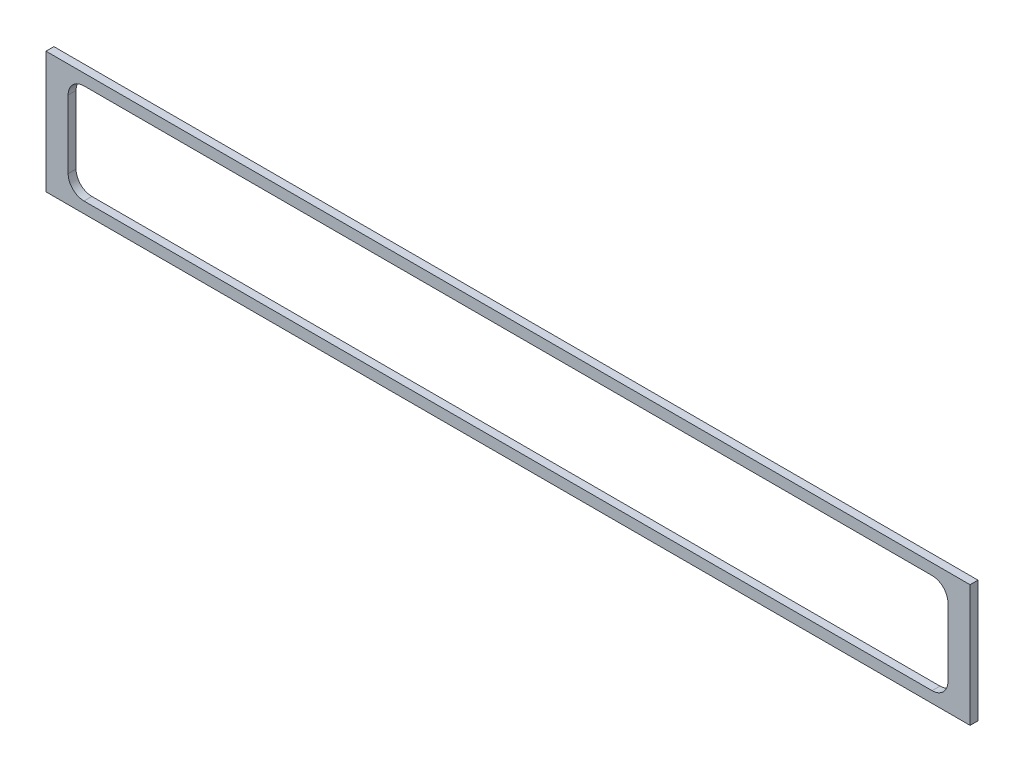
ISO-10303-21;
HEADER;
FILE_DESCRIPTION(('STEP AP214'),'2;1');
FILE_NAME('part.step','',(''),(''),'','','');
FILE_SCHEMA(('AUTOMOTIVE_DESIGN { 1 0 10303 214 1 1 1 1 }'));
ENDSEC;
DATA;
#1=APPLICATION_CONTEXT('core data for automotive mechanical design processes');
#2=APPLICATION_PROTOCOL_DEFINITION('international standard','automotive_design',2000,#1);
#3=PRODUCT_CONTEXT('',#1,'mechanical');
#4=PRODUCT('Part','Part','',(#3));
#5=PRODUCT_RELATED_PRODUCT_CATEGORY('part','',(#4));
#6=PRODUCT_DEFINITION_FORMATION('','',#4);
#7=PRODUCT_DEFINITION_CONTEXT('part definition',#1,'design');
#8=PRODUCT_DEFINITION('design','',#6,#7);
#9=PRODUCT_DEFINITION_SHAPE('','',#8);
#10=(LENGTH_UNIT() NAMED_UNIT(*) SI_UNIT(.MILLI.,.METRE.));
#11=(NAMED_UNIT(*) PLANE_ANGLE_UNIT() SI_UNIT($,.RADIAN.));
#12=(NAMED_UNIT(*) SI_UNIT($,.STERADIAN.) SOLID_ANGLE_UNIT());
#13=UNCERTAINTY_MEASURE_WITH_UNIT(LENGTH_MEASURE(1.E-05),#10,'distance_accuracy_value','');
#14=(GEOMETRIC_REPRESENTATION_CONTEXT(3) GLOBAL_UNCERTAINTY_ASSIGNED_CONTEXT((#13)) GLOBAL_UNIT_ASSIGNED_CONTEXT((#10,
#11,#12)) REPRESENTATION_CONTEXT('',''));
#15=CARTESIAN_POINT('',(0.,0.,0.));
#16=DIRECTION('',(0.,0.,1.));
#17=DIRECTION('',(1.,0.,0.));
#18=AXIS2_PLACEMENT_3D('',#15,#16,#17);
#19=CARTESIAN_POINT('',(-275.196525515744,118.258414766558,5.));
#20=DIRECTION('',(1.,0.,0.));
#21=DIRECTION('',(0.,0.,-1.));
#22=AXIS2_PLACEMENT_3D('',#19,#20,#21);
#23=PLANE('',#22);
#24=DIRECTION('',(0.,-1.,0.));
#25=VECTOR('',#24,1.);
#26=CARTESIAN_POINT('',(-275.196525515744,118.258414766558,0.));
#27=LINE('',#26,#25);
#28=CARTESIAN_POINT('',(-275.196525515744,118.258414766558,0.));
#29=VERTEX_POINT('',#28);
#30=CARTESIAN_POINT('',(-275.196525515744,41.2584147665581,0.));
#31=VERTEX_POINT('',#30);
#32=EDGE_CURVE('E203',#29,#31,#27,.T.);
#33=ORIENTED_EDGE('',*,*,#32,.T.);
#34=DIRECTION('',(0.,0.,-1.));
#35=VECTOR('',#34,1.);
#36=CARTESIAN_POINT('',(-275.196525515744,41.2584147665581,5.));
#37=LINE('',#36,#35);
#38=CARTESIAN_POINT('',(-275.196525515744,41.2584147665581,5.));
#39=VERTEX_POINT('',#38);
#40=EDGE_CURVE('E11',#39,#31,#37,.T.);
#41=ORIENTED_EDGE('',*,*,#40,.F.);
#42=DIRECTION('',(0.,-1.,0.));
#43=VECTOR('',#42,1.);
#44=CARTESIAN_POINT('',(-275.196525515744,118.258414766558,5.));
#45=LINE('',#44,#43);
#46=CARTESIAN_POINT('',(-275.196525515744,118.258414766558,5.));
#47=VERTEX_POINT('',#46);
#48=EDGE_CURVE('E221',#47,#39,#45,.T.);
#49=ORIENTED_EDGE('',*,*,#48,.F.);
#50=DIRECTION('',(0.,0.,-1.));
#51=VECTOR('',#50,1.);
#52=CARTESIAN_POINT('',(-275.196525515744,118.258414766558,5.));
#53=LINE('',#52,#51);
#54=EDGE_CURVE('E235',#47,#29,#53,.T.);
#55=ORIENTED_EDGE('',*,*,#54,.T.);
#56=EDGE_LOOP('',(#33,#41,#49,#55));
#57=FACE_BOUND('',#56,.T.);
#58=ADVANCED_FACE('F39',(#57),#23,.F.);
#59=CARTESIAN_POINT('',(-275.196525515744,41.2584147665581,5.));
#60=DIRECTION('',(0.,1.,0.));
#61=DIRECTION('',(0.,0.,1.));
#62=AXIS2_PLACEMENT_3D('',#59,#60,#61);
#63=PLANE('',#62);
#64=DIRECTION('',(1.,0.,0.));
#65=VECTOR('',#64,1.);
#66=CARTESIAN_POINT('',(-275.196525515744,41.2584147665581,0.));
#67=LINE('',#66,#65);
#68=CARTESIAN_POINT('',(308.803474484256,41.2584147665581,0.));
#69=VERTEX_POINT('',#68);
#70=EDGE_CURVE('E239',#31,#69,#67,.T.);
#71=ORIENTED_EDGE('',*,*,#70,.T.);
#72=DIRECTION('',(0.,0.,-1.));
#73=VECTOR('',#72,1.);
#74=CARTESIAN_POINT('',(308.803474484256,41.2584147665581,5.));
#75=LINE('',#74,#73);
#76=CARTESIAN_POINT('',(308.803474484256,41.2584147665581,5.));
#77=VERTEX_POINT('',#76);
#78=EDGE_CURVE('E47',#77,#69,#75,.T.);
#79=ORIENTED_EDGE('',*,*,#78,.F.);
#80=DIRECTION('',(1.,0.,0.));
#81=VECTOR('',#80,1.);
#82=CARTESIAN_POINT('',(-275.196525515744,41.2584147665581,5.));
#83=LINE('',#82,#81);
#84=EDGE_CURVE('E225',#39,#77,#83,.T.);
#85=ORIENTED_EDGE('',*,*,#84,.F.);
#86=ORIENTED_EDGE('',*,*,#40,.T.);
#87=EDGE_LOOP('',(#71,#79,#85,#86));
#88=FACE_BOUND('',#87,.T.);
#89=ADVANCED_FACE('F273',(#88),#63,.F.);
#90=CARTESIAN_POINT('',(308.803474484256,118.258414766558,5.));
#91=DIRECTION('',(-1.,0.,0.));
#92=DIRECTION('',(0.,-1.,0.));
#93=AXIS2_PLACEMENT_3D('',#90,#91,#92);
#94=PLANE('',#93);
#95=DIRECTION('',(0.,1.,0.));
#96=VECTOR('',#95,1.);
#97=CARTESIAN_POINT('',(308.803474484256,118.258414766558,0.));
#98=LINE('',#97,#96);
#99=CARTESIAN_POINT('',(308.803474484256,118.258414766558,0.));
#100=VERTEX_POINT('',#99);
#101=EDGE_CURVE('E242',#69,#100,#98,.T.);
#102=ORIENTED_EDGE('',*,*,#101,.T.);
#103=DIRECTION('',(0.,0.,-1.));
#104=VECTOR('',#103,1.);
#105=CARTESIAN_POINT('',(308.803474484256,118.258414766558,5.));
#106=LINE('',#105,#104);
#107=CARTESIAN_POINT('',(308.803474484256,118.258414766558,5.));
#108=VERTEX_POINT('',#107);
#109=EDGE_CURVE('E250',#108,#100,#106,.T.);
#110=ORIENTED_EDGE('',*,*,#109,.F.);
#111=DIRECTION('',(0.,1.,0.));
#112=VECTOR('',#111,1.);
#113=CARTESIAN_POINT('',(308.803474484256,118.258414766558,5.));
#114=LINE('',#113,#112);
#115=EDGE_CURVE('E229',#77,#108,#114,.T.);
#116=ORIENTED_EDGE('',*,*,#115,.F.);
#117=ORIENTED_EDGE('',*,*,#78,.T.);
#118=EDGE_LOOP('',(#102,#110,#116,#117));
#119=FACE_BOUND('',#118,.T.);
#120=ADVANCED_FACE('F259',(#119),#94,.F.);
#121=CARTESIAN_POINT('',(-275.196525515744,118.258414766558,5.));
#122=DIRECTION('',(0.,-1.,0.));
#123=DIRECTION('',(0.,0.,-1.));
#124=AXIS2_PLACEMENT_3D('',#121,#122,#123);
#125=PLANE('',#124);
#126=DIRECTION('',(-1.,0.,0.));
#127=VECTOR('',#126,1.);
#128=CARTESIAN_POINT('',(-275.196525515744,118.258414766558,0.));
#129=LINE('',#128,#127);
#130=EDGE_CURVE('E226',#100,#29,#129,.T.);
#131=ORIENTED_EDGE('',*,*,#130,.T.);
#132=ORIENTED_EDGE('',*,*,#54,.F.);
#133=DIRECTION('',(-1.,0.,0.));
#134=VECTOR('',#133,1.);
#135=CARTESIAN_POINT('',(-275.196525515744,118.258414766558,5.));
#136=LINE('',#135,#134);
#137=EDGE_CURVE('E232',#108,#47,#136,.T.);
#138=ORIENTED_EDGE('',*,*,#137,.F.);
#139=ORIENTED_EDGE('',*,*,#109,.T.);
#140=EDGE_LOOP('',(#131,#132,#138,#139));
#141=FACE_BOUND('',#140,.T.);
#142=ADVANCED_FACE('F266',(#141),#125,.F.);
#143=CARTESIAN_POINT('',(0.,0.,5.));
#144=DIRECTION('',(0.,0.,1.));
#145=DIRECTION('',(1.,0.,0.));
#146=AXIS2_PLACEMENT_3D('',#143,#144,#145);
#147=PLANE('',#146);
#148=CARTESIAN_POINT('',(284.803474484256,101.258414766558,5.));
#149=DIRECTION('',(0.,0.,1.));
#150=DIRECTION('',(-1.,0.,0.));
#151=AXIS2_PLACEMENT_3D('',#148,#149,#150);
#152=CIRCLE('',#151,10.);
#153=CARTESIAN_POINT('',(294.803474484256,101.258414766558,5.));
#154=VERTEX_POINT('',#153);
#155=CARTESIAN_POINT('',(284.803474484256,111.258414766558,5.));
#156=VERTEX_POINT('',#155);
#157=EDGE_CURVE('E54',#154,#156,#152,.T.);
#158=ORIENTED_EDGE('',*,*,#157,.F.);
#159=DIRECTION('',(0.,1.,0.));
#160=VECTOR('',#159,1.);
#161=CARTESIAN_POINT('',(294.803474484256,101.258414766558,5.));
#162=LINE('',#161,#160);
#163=CARTESIAN_POINT('',(294.803474484256,58.2584147665582,5.));
#164=VERTEX_POINT('',#163);
#165=EDGE_CURVE('E150',#164,#154,#162,.T.);
#166=ORIENTED_EDGE('',*,*,#165,.F.);
#167=CARTESIAN_POINT('',(284.803474484256,58.2584147665581,5.));
#168=DIRECTION('',(0.,0.,1.));
#169=DIRECTION('',(-1.,0.,0.));
#170=AXIS2_PLACEMENT_3D('',#167,#168,#169);
#171=CIRCLE('',#170,10.);
#172=CARTESIAN_POINT('',(284.803474484256,48.2584147665581,5.));
#173=VERTEX_POINT('',#172);
#174=EDGE_CURVE('E154',#173,#164,#171,.T.);
#175=ORIENTED_EDGE('',*,*,#174,.F.);
#176=DIRECTION('',(1.,0.,0.));
#177=VECTOR('',#176,1.);
#178=CARTESIAN_POINT('',(-251.196525515744,48.2584147665581,5.));
#179=LINE('',#178,#177);
#180=CARTESIAN_POINT('',(-251.196525515744,48.2584147665581,5.));
#181=VERTEX_POINT('',#180);
#182=EDGE_CURVE('E193',#181,#173,#179,.T.);
#183=ORIENTED_EDGE('',*,*,#182,.F.);
#184=CARTESIAN_POINT('',(-251.196525515744,58.2584147665581,5.));
#185=DIRECTION('',(0.,0.,1.));
#186=DIRECTION('',(1.,0.,0.));
#187=AXIS2_PLACEMENT_3D('',#184,#185,#186);
#188=CIRCLE('',#187,10.);
#189=CARTESIAN_POINT('',(-261.196525515744,58.2584147665582,5.));
#190=VERTEX_POINT('',#189);
#191=EDGE_CURVE('E189',#190,#181,#188,.T.);
#192=ORIENTED_EDGE('',*,*,#191,.F.);
#193=DIRECTION('',(0.,-1.,0.));
#194=VECTOR('',#193,1.);
#195=CARTESIAN_POINT('',(-261.196525515744,101.258414766558,5.));
#196=LINE('',#195,#194);
#197=CARTESIAN_POINT('',(-261.196525515744,101.258414766558,5.));
#198=VERTEX_POINT('',#197);
#199=EDGE_CURVE('E185',#198,#190,#196,.T.);
#200=ORIENTED_EDGE('',*,*,#199,.F.);
#201=CARTESIAN_POINT('',(-251.196525515744,101.258414766558,5.));
#202=DIRECTION('',(0.,0.,1.));
#203=DIRECTION('',(-1.,0.,0.));
#204=AXIS2_PLACEMENT_3D('',#201,#202,#203);
#205=CIRCLE('',#204,10.);
#206=CARTESIAN_POINT('',(-251.196525515744,111.258414766558,5.));
#207=VERTEX_POINT('',#206);
#208=EDGE_CURVE('E181',#207,#198,#205,.T.);
#209=ORIENTED_EDGE('',*,*,#208,.F.);
#210=DIRECTION('',(-1.,0.,0.));
#211=VECTOR('',#210,1.);
#212=CARTESIAN_POINT('',(-251.196525515744,111.258414766558,5.));
#213=LINE('',#212,#211);
#214=EDGE_CURVE('E178',#156,#207,#213,.T.);
#215=ORIENTED_EDGE('',*,*,#214,.F.);
#216=EDGE_LOOP('',(#158,#166,#175,#183,#192,#200,#209,#215));
#217=FACE_BOUND('',#216,.T.);
#218=ORIENTED_EDGE('',*,*,#48,.T.);
#219=ORIENTED_EDGE('',*,*,#84,.T.);
#220=ORIENTED_EDGE('',*,*,#115,.T.);
#221=ORIENTED_EDGE('',*,*,#137,.T.);
#222=EDGE_LOOP('',(#218,#219,#220,#221));
#223=FACE_BOUND('',#222,.T.);
#224=ADVANCED_FACE('F272',(#217,#223),#147,.T.);
#225=CARTESIAN_POINT('',(0.,0.,0.));
#226=DIRECTION('',(0.,0.,1.));
#227=DIRECTION('',(1.,0.,0.));
#228=AXIS2_PLACEMENT_3D('',#225,#226,#227);
#229=PLANE('',#228);
#230=DIRECTION('',(0.,1.,0.));
#231=VECTOR('',#230,1.);
#232=CARTESIAN_POINT('',(294.803474484256,101.258414766558,0.));
#233=LINE('',#232,#231);
#234=CARTESIAN_POINT('',(294.803474484256,58.2584147665582,0.));
#235=VERTEX_POINT('',#234);
#236=CARTESIAN_POINT('',(294.803474484256,101.258414766558,0.));
#237=VERTEX_POINT('',#236);
#238=EDGE_CURVE('E137',#235,#237,#233,.T.);
#239=ORIENTED_EDGE('',*,*,#238,.T.);
#240=CARTESIAN_POINT('',(284.803474484256,101.258414766558,0.));
#241=DIRECTION('',(0.,0.,1.));
#242=DIRECTION('',(-1.,0.,0.));
#243=AXIS2_PLACEMENT_3D('',#240,#241,#242);
#244=CIRCLE('',#243,10.);
#245=CARTESIAN_POINT('',(284.803474484256,111.258414766558,0.));
#246=VERTEX_POINT('',#245);
#247=EDGE_CURVE('E130',#237,#246,#244,.T.);
#248=ORIENTED_EDGE('',*,*,#247,.T.);
#249=DIRECTION('',(-1.,0.,0.));
#250=VECTOR('',#249,1.);
#251=CARTESIAN_POINT('',(-251.196525515744,111.258414766558,0.));
#252=LINE('',#251,#250);
#253=CARTESIAN_POINT('',(-251.196525515744,111.258414766558,0.));
#254=VERTEX_POINT('',#253);
#255=EDGE_CURVE('E140',#246,#254,#252,.T.);
#256=ORIENTED_EDGE('',*,*,#255,.T.);
#257=CARTESIAN_POINT('',(-251.196525515744,101.258414766558,0.));
#258=DIRECTION('',(0.,0.,1.));
#259=DIRECTION('',(-1.,0.,0.));
#260=AXIS2_PLACEMENT_3D('',#257,#258,#259);
#261=CIRCLE('',#260,10.);
#262=CARTESIAN_POINT('',(-261.196525515744,101.258414766558,0.));
#263=VERTEX_POINT('',#262);
#264=EDGE_CURVE('E62',#254,#263,#261,.T.);
#265=ORIENTED_EDGE('',*,*,#264,.T.);
#266=DIRECTION('',(0.,-1.,0.));
#267=VECTOR('',#266,1.);
#268=CARTESIAN_POINT('',(-261.196525515744,101.258414766558,0.));
#269=LINE('',#268,#267);
#270=CARTESIAN_POINT('',(-261.196525515744,58.2584147665582,0.));
#271=VERTEX_POINT('',#270);
#272=EDGE_CURVE('E159',#263,#271,#269,.T.);
#273=ORIENTED_EDGE('',*,*,#272,.T.);
#274=CARTESIAN_POINT('',(-251.196525515744,58.2584147665581,0.));
#275=DIRECTION('',(0.,0.,1.));
#276=DIRECTION('',(1.,0.,0.));
#277=AXIS2_PLACEMENT_3D('',#274,#275,#276);
#278=CIRCLE('',#277,10.);
#279=CARTESIAN_POINT('',(-251.196525515744,48.2584147665581,0.));
#280=VERTEX_POINT('',#279);
#281=EDGE_CURVE('E163',#271,#280,#278,.T.);
#282=ORIENTED_EDGE('',*,*,#281,.T.);
#283=DIRECTION('',(1.,0.,0.));
#284=VECTOR('',#283,1.);
#285=CARTESIAN_POINT('',(-251.196525515744,48.2584147665581,0.));
#286=LINE('',#285,#284);
#287=CARTESIAN_POINT('',(284.803474484256,48.2584147665581,0.));
#288=VERTEX_POINT('',#287);
#289=EDGE_CURVE('E167',#280,#288,#286,.T.);
#290=ORIENTED_EDGE('',*,*,#289,.T.);
#291=CARTESIAN_POINT('',(284.803474484256,58.2584147665581,0.));
#292=DIRECTION('',(0.,0.,1.));
#293=DIRECTION('',(-1.,0.,0.));
#294=AXIS2_PLACEMENT_3D('',#291,#292,#293);
#295=CIRCLE('',#294,10.);
#296=EDGE_CURVE('E171',#288,#235,#295,.T.);
#297=ORIENTED_EDGE('',*,*,#296,.T.);
#298=EDGE_LOOP('',(#239,#248,#256,#265,#273,#282,#290,#297));
#299=FACE_BOUND('',#298,.T.);
#300=ORIENTED_EDGE('',*,*,#32,.F.);
#301=ORIENTED_EDGE('',*,*,#130,.F.);
#302=ORIENTED_EDGE('',*,*,#101,.F.);
#303=ORIENTED_EDGE('',*,*,#70,.F.);
#304=EDGE_LOOP('',(#300,#301,#302,#303));
#305=FACE_BOUND('',#304,.T.);
#306=ADVANCED_FACE('F145',(#299,#305),#229,.F.);
#307=CARTESIAN_POINT('',(284.803474484256,101.258414766558,0.));
#308=DIRECTION('',(0.,0.,1.));
#309=DIRECTION('',(1.,0.,0.));
#310=AXIS2_PLACEMENT_3D('',#307,#308,#309);
#311=CYLINDRICAL_SURFACE('',#310,10.);
#312=ORIENTED_EDGE('',*,*,#157,.T.);
#313=DIRECTION('',(0.,0.,1.));
#314=VECTOR('',#313,1.);
#315=CARTESIAN_POINT('',(284.803474484256,111.258414766558,0.));
#316=LINE('',#315,#314);
#317=EDGE_CURVE('E126',#246,#156,#316,.T.);
#318=ORIENTED_EDGE('',*,*,#317,.F.);
#319=ORIENTED_EDGE('',*,*,#247,.F.);
#320=DIRECTION('',(0.,0.,1.));
#321=VECTOR('',#320,1.);
#322=CARTESIAN_POINT('',(294.803474484256,101.258414766558,0.));
#323=LINE('',#322,#321);
#324=EDGE_CURVE('E200',#237,#154,#323,.T.);
#325=ORIENTED_EDGE('',*,*,#324,.T.);
#326=EDGE_LOOP('',(#312,#318,#319,#325));
#327=FACE_BOUND('',#326,.T.);
#328=ADVANCED_FACE('F128',(#327),#311,.F.);
#329=CARTESIAN_POINT('',(294.803474484256,101.258414766558,0.));
#330=DIRECTION('',(1.,0.,0.));
#331=DIRECTION('',(0.,0.,-1.));
#332=AXIS2_PLACEMENT_3D('',#329,#330,#331);
#333=PLANE('',#332);
#334=ORIENTED_EDGE('',*,*,#165,.T.);
#335=ORIENTED_EDGE('',*,*,#324,.F.);
#336=ORIENTED_EDGE('',*,*,#238,.F.);
#337=DIRECTION('',(0.,0.,1.));
#338=VECTOR('',#337,1.);
#339=CARTESIAN_POINT('',(294.803474484256,58.2584147665582,0.));
#340=LINE('',#339,#338);
#341=EDGE_CURVE('E204',#235,#164,#340,.T.);
#342=ORIENTED_EDGE('',*,*,#341,.T.);
#343=EDGE_LOOP('',(#334,#335,#336,#342));
#344=FACE_BOUND('',#343,.T.);
#345=ADVANCED_FACE('F290',(#344),#333,.F.);
#346=CARTESIAN_POINT('',(284.803474484256,58.2584147665581,0.));
#347=DIRECTION('',(0.,0.,1.));
#348=DIRECTION('',(1.,0.,0.));
#349=AXIS2_PLACEMENT_3D('',#346,#347,#348);
#350=CYLINDRICAL_SURFACE('',#349,10.);
#351=ORIENTED_EDGE('',*,*,#174,.T.);
#352=ORIENTED_EDGE('',*,*,#341,.F.);
#353=ORIENTED_EDGE('',*,*,#296,.F.);
#354=DIRECTION('',(0.,0.,1.));
#355=VECTOR('',#354,1.);
#356=CARTESIAN_POINT('',(284.803474484256,48.2584147665581,0.));
#357=LINE('',#356,#355);
#358=EDGE_CURVE('E207',#288,#173,#357,.T.);
#359=ORIENTED_EDGE('',*,*,#358,.T.);
#360=EDGE_LOOP('',(#351,#352,#353,#359));
#361=FACE_BOUND('',#360,.T.);
#362=ADVANCED_FACE('F307',(#361),#350,.F.);
#363=CARTESIAN_POINT('',(-251.196525515744,48.2584147665581,0.));
#364=DIRECTION('',(0.,-1.,0.));
#365=DIRECTION('',(0.,0.,-1.));
#366=AXIS2_PLACEMENT_3D('',#363,#364,#365);
#367=PLANE('',#366);
#368=ORIENTED_EDGE('',*,*,#182,.T.);
#369=ORIENTED_EDGE('',*,*,#358,.F.);
#370=ORIENTED_EDGE('',*,*,#289,.F.);
#371=DIRECTION('',(0.,0.,1.));
#372=VECTOR('',#371,1.);
#373=CARTESIAN_POINT('',(-251.196525515744,48.2584147665581,0.));
#374=LINE('',#373,#372);
#375=EDGE_CURVE('E210',#280,#181,#374,.T.);
#376=ORIENTED_EDGE('',*,*,#375,.T.);
#377=EDGE_LOOP('',(#368,#369,#370,#376));
#378=FACE_BOUND('',#377,.T.);
#379=ADVANCED_FACE('F303',(#378),#367,.F.);
#380=CARTESIAN_POINT('',(-251.196525515744,58.2584147665581,0.));
#381=DIRECTION('',(0.,0.,1.));
#382=DIRECTION('',(1.,0.,0.));
#383=AXIS2_PLACEMENT_3D('',#380,#381,#382);
#384=CYLINDRICAL_SURFACE('',#383,10.);
#385=ORIENTED_EDGE('',*,*,#191,.T.);
#386=ORIENTED_EDGE('',*,*,#375,.F.);
#387=ORIENTED_EDGE('',*,*,#281,.F.);
#388=DIRECTION('',(0.,0.,1.));
#389=VECTOR('',#388,1.);
#390=CARTESIAN_POINT('',(-261.196525515744,58.2584147665582,0.));
#391=LINE('',#390,#389);
#392=EDGE_CURVE('E213',#271,#190,#391,.T.);
#393=ORIENTED_EDGE('',*,*,#392,.T.);
#394=EDGE_LOOP('',(#385,#386,#387,#393));
#395=FACE_BOUND('',#394,.T.);
#396=ADVANCED_FACE('F299',(#395),#384,.F.);
#397=CARTESIAN_POINT('',(-261.196525515744,101.258414766558,0.));
#398=DIRECTION('',(-1.,0.,0.));
#399=DIRECTION('',(0.,0.,1.));
#400=AXIS2_PLACEMENT_3D('',#397,#398,#399);
#401=PLANE('',#400);
#402=ORIENTED_EDGE('',*,*,#199,.T.);
#403=ORIENTED_EDGE('',*,*,#392,.F.);
#404=ORIENTED_EDGE('',*,*,#272,.F.);
#405=DIRECTION('',(0.,0.,1.));
#406=VECTOR('',#405,1.);
#407=CARTESIAN_POINT('',(-261.196525515744,101.258414766558,0.));
#408=LINE('',#407,#406);
#409=EDGE_CURVE('E216',#263,#198,#408,.T.);
#410=ORIENTED_EDGE('',*,*,#409,.T.);
#411=EDGE_LOOP('',(#402,#403,#404,#410));
#412=FACE_BOUND('',#411,.T.);
#413=ADVANCED_FACE('F296',(#412),#401,.F.);
#414=CARTESIAN_POINT('',(-251.196525515744,101.258414766558,0.));
#415=DIRECTION('',(0.,0.,1.));
#416=DIRECTION('',(1.,0.,0.));
#417=AXIS2_PLACEMENT_3D('',#414,#415,#416);
#418=CYLINDRICAL_SURFACE('',#417,10.);
#419=ORIENTED_EDGE('',*,*,#208,.T.);
#420=ORIENTED_EDGE('',*,*,#409,.F.);
#421=ORIENTED_EDGE('',*,*,#264,.F.);
#422=DIRECTION('',(0.,0.,1.));
#423=VECTOR('',#422,1.);
#424=CARTESIAN_POINT('',(-251.196525515744,111.258414766558,0.));
#425=LINE('',#424,#423);
#426=EDGE_CURVE('E136',#254,#207,#425,.T.);
#427=ORIENTED_EDGE('',*,*,#426,.T.);
#428=EDGE_LOOP('',(#419,#420,#421,#427));
#429=FACE_BOUND('',#428,.T.);
#430=ADVANCED_FACE('F293',(#429),#418,.F.);
#431=CARTESIAN_POINT('',(-251.196525515744,111.258414766558,0.));
#432=DIRECTION('',(0.,1.,0.));
#433=DIRECTION('',(0.,0.,1.));
#434=AXIS2_PLACEMENT_3D('',#431,#432,#433);
#435=PLANE('',#434);
#436=ORIENTED_EDGE('',*,*,#214,.T.);
#437=ORIENTED_EDGE('',*,*,#426,.F.);
#438=ORIENTED_EDGE('',*,*,#255,.F.);
#439=ORIENTED_EDGE('',*,*,#317,.T.);
#440=EDGE_LOOP('',(#436,#437,#438,#439));
#441=FACE_BOUND('',#440,.T.);
#442=ADVANCED_FACE('F141',(#441),#435,.F.);
#443=CLOSED_SHELL('',(#58,#89,#120,#142,#224,#306,#328,#345,#362,#379,#396,#413,#430,#442));
#444=MANIFOLD_SOLID_BREP('B2',#443);
#445=ADVANCED_BREP_SHAPE_REPRESENTATION('',(#18,#444),#14);
#446=SHAPE_DEFINITION_REPRESENTATION(#9,#445);
ENDSEC;
END-ISO-10303-21;
